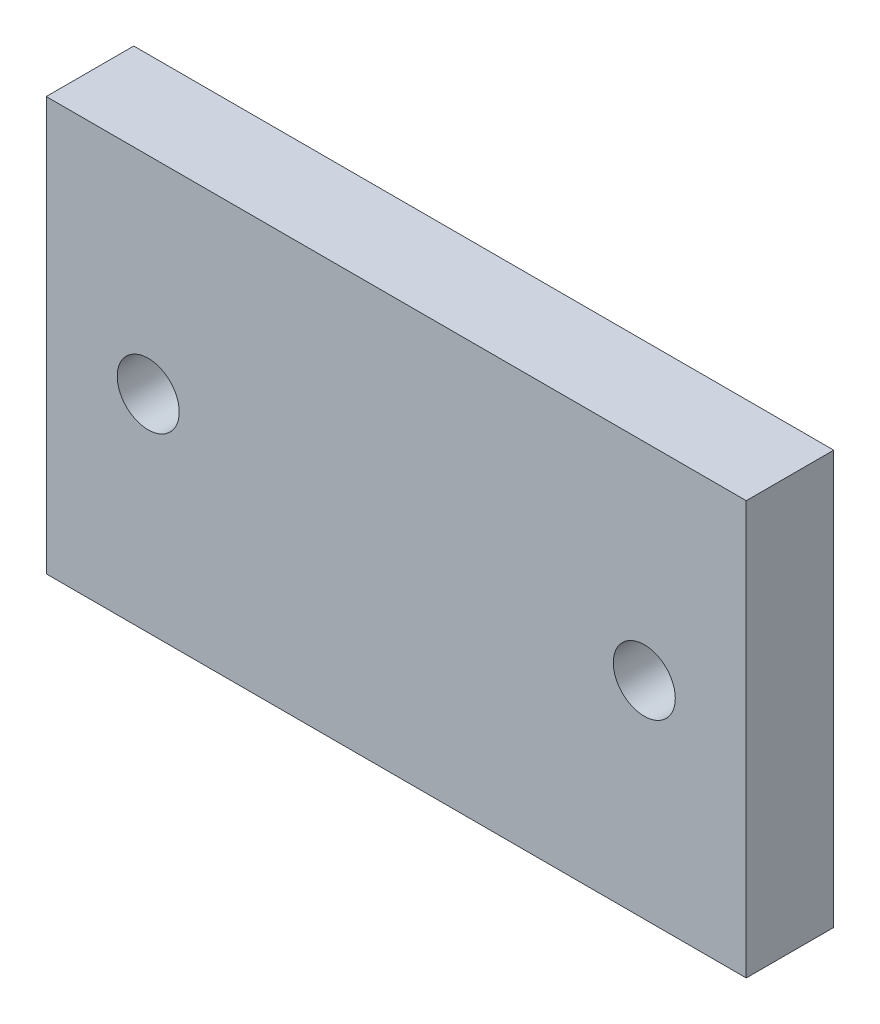
ISO-10303-21;
HEADER;
FILE_DESCRIPTION(('STEP AP214'),'2;1');
FILE_NAME('part.step','',(''),(''),'','','');
FILE_SCHEMA(('AUTOMOTIVE_DESIGN { 1 0 10303 214 1 1 1 1 }'));
ENDSEC;
DATA;
#1=APPLICATION_CONTEXT('core data for automotive mechanical design processes');
#2=APPLICATION_PROTOCOL_DEFINITION('international standard','automotive_design',2000,#1);
#3=PRODUCT_CONTEXT('',#1,'mechanical');
#4=PRODUCT('Part','Part','',(#3));
#5=PRODUCT_RELATED_PRODUCT_CATEGORY('part','',(#4));
#6=PRODUCT_DEFINITION_FORMATION('','',#4);
#7=PRODUCT_DEFINITION_CONTEXT('part definition',#1,'design');
#8=PRODUCT_DEFINITION('design','',#6,#7);
#9=PRODUCT_DEFINITION_SHAPE('','',#8);
#10=(LENGTH_UNIT() NAMED_UNIT(*) SI_UNIT(.MILLI.,.METRE.));
#11=(NAMED_UNIT(*) PLANE_ANGLE_UNIT() SI_UNIT($,.RADIAN.));
#12=(NAMED_UNIT(*) SI_UNIT($,.STERADIAN.) SOLID_ANGLE_UNIT());
#13=UNCERTAINTY_MEASURE_WITH_UNIT(LENGTH_MEASURE(1.E-05),#10,'distance_accuracy_value','');
#14=(GEOMETRIC_REPRESENTATION_CONTEXT(3) GLOBAL_UNCERTAINTY_ASSIGNED_CONTEXT((#13)) GLOBAL_UNIT_ASSIGNED_CONTEXT((#10,
#11,#12)) REPRESENTATION_CONTEXT('',''));
#15=CARTESIAN_POINT('',(0.,0.,0.));
#16=DIRECTION('',(0.,0.,1.));
#17=DIRECTION('',(1.,0.,0.));
#18=AXIS2_PLACEMENT_3D('',#15,#16,#17);
#19=CARTESIAN_POINT('',(0.,0.,6.35));
#20=DIRECTION('',(0.,0.,-1.));
#21=DIRECTION('',(-1.,0.,0.));
#22=AXIS2_PLACEMENT_3D('',#19,#20,#21);
#23=PLANE('',#22);
#24=CARTESIAN_POINT('',(7.400000059,15.,6.35));
#25=DIRECTION('',(0.,0.,1.));
#26=DIRECTION('',(1.,0.,0.));
#27=AXIS2_PLACEMENT_3D('',#24,#25,#26);
#28=CIRCLE('',#27,2.25);
#29=CARTESIAN_POINT('',(9.650000059,15.,6.35));
#30=VERTEX_POINT('',#29);
#31=EDGE_CURVE('E142',#30,#30,#28,.T.);
#32=ORIENTED_EDGE('',*,*,#31,.F.);
#33=EDGE_LOOP('',(#32));
#34=FACE_BOUND('',#33,.T.);
#35=DIRECTION('',(0.,-1.,0.));
#36=VECTOR('',#35,1.);
#37=CARTESIAN_POINT('',(0.,0.,6.35));
#38=LINE('',#37,#36);
#39=CARTESIAN_POINT('',(0.,30.,6.35));
#40=VERTEX_POINT('',#39);
#41=CARTESIAN_POINT('',(0.,0.,6.35));
#42=VERTEX_POINT('',#41);
#43=EDGE_CURVE('E150',#40,#42,#38,.T.);
#44=ORIENTED_EDGE('',*,*,#43,.T.);
#45=DIRECTION('',(1.,0.,0.));
#46=VECTOR('',#45,1.);
#47=CARTESIAN_POINT('',(0.,0.,6.35));
#48=LINE('',#47,#46);
#49=CARTESIAN_POINT('',(50.8,0.,6.35));
#50=VERTEX_POINT('',#49);
#51=EDGE_CURVE('E101',#42,#50,#48,.T.);
#52=ORIENTED_EDGE('',*,*,#51,.T.);
#53=DIRECTION('',(0.,1.,0.));
#54=VECTOR('',#53,1.);
#55=CARTESIAN_POINT('',(50.8,0.,6.35));
#56=LINE('',#55,#54);
#57=CARTESIAN_POINT('',(50.8,30.,6.35));
#58=VERTEX_POINT('',#57);
#59=EDGE_CURVE('E155',#50,#58,#56,.T.);
#60=ORIENTED_EDGE('',*,*,#59,.T.);
#61=DIRECTION('',(-1.,0.,0.));
#62=VECTOR('',#61,1.);
#63=CARTESIAN_POINT('',(0.,30.,6.35));
#64=LINE('',#63,#62);
#65=EDGE_CURVE('E70',#58,#40,#64,.T.);
#66=ORIENTED_EDGE('',*,*,#65,.T.);
#67=EDGE_LOOP('',(#44,#52,#60,#66));
#68=FACE_BOUND('',#67,.T.);
#69=CARTESIAN_POINT('',(43.400000059,15.,6.35));
#70=DIRECTION('',(0.,0.,1.));
#71=DIRECTION('',(1.,0.,0.));
#72=AXIS2_PLACEMENT_3D('',#69,#70,#71);
#73=CIRCLE('',#72,2.25);
#74=CARTESIAN_POINT('',(45.650000059,15.,6.35));
#75=VERTEX_POINT('',#74);
#76=EDGE_CURVE('E135',#75,#75,#73,.T.);
#77=ORIENTED_EDGE('',*,*,#76,.F.);
#78=EDGE_LOOP('',(#77));
#79=FACE_BOUND('',#78,.T.);
#80=ADVANCED_FACE('F52',(#34,#68,#79),#23,.F.);
#81=CARTESIAN_POINT('',(0.,0.,0.));
#82=DIRECTION('',(0.,0.,-1.));
#83=DIRECTION('',(-1.,0.,0.));
#84=AXIS2_PLACEMENT_3D('',#81,#82,#83);
#85=PLANE('',#84);
#86=CARTESIAN_POINT('',(7.400000059,15.,0.));
#87=DIRECTION('',(0.,0.,1.));
#88=DIRECTION('',(1.,0.,0.));
#89=AXIS2_PLACEMENT_3D('',#86,#87,#88);
#90=CIRCLE('',#89,2.25);
#91=CARTESIAN_POINT('',(9.650000059,15.,0.));
#92=VERTEX_POINT('',#91);
#93=EDGE_CURVE('E139',#92,#92,#90,.T.);
#94=ORIENTED_EDGE('',*,*,#93,.T.);
#95=EDGE_LOOP('',(#94));
#96=FACE_BOUND('',#95,.T.);
#97=DIRECTION('',(0.,-1.,0.));
#98=VECTOR('',#97,1.);
#99=CARTESIAN_POINT('',(0.,0.,0.));
#100=LINE('',#99,#98);
#101=CARTESIAN_POINT('',(0.,30.,0.));
#102=VERTEX_POINT('',#101);
#103=CARTESIAN_POINT('',(0.,0.,0.));
#104=VERTEX_POINT('',#103);
#105=EDGE_CURVE('E146',#102,#104,#100,.T.);
#106=ORIENTED_EDGE('',*,*,#105,.F.);
#107=DIRECTION('',(-1.,0.,0.));
#108=VECTOR('',#107,1.);
#109=CARTESIAN_POINT('',(0.,30.,0.));
#110=LINE('',#109,#108);
#111=CARTESIAN_POINT('',(50.8,30.,0.));
#112=VERTEX_POINT('',#111);
#113=EDGE_CURVE('E94',#112,#102,#110,.T.);
#114=ORIENTED_EDGE('',*,*,#113,.F.);
#115=DIRECTION('',(0.,1.,0.));
#116=VECTOR('',#115,1.);
#117=CARTESIAN_POINT('',(50.8,0.,0.));
#118=LINE('',#117,#116);
#119=CARTESIAN_POINT('',(50.8,0.,0.));
#120=VERTEX_POINT('',#119);
#121=EDGE_CURVE('E88',#120,#112,#118,.T.);
#122=ORIENTED_EDGE('',*,*,#121,.F.);
#123=DIRECTION('',(1.,0.,0.));
#124=VECTOR('',#123,1.);
#125=CARTESIAN_POINT('',(0.,0.,0.));
#126=LINE('',#125,#124);
#127=EDGE_CURVE('E164',#104,#120,#126,.T.);
#128=ORIENTED_EDGE('',*,*,#127,.F.);
#129=EDGE_LOOP('',(#106,#114,#122,#128));
#130=FACE_BOUND('',#129,.T.);
#131=CARTESIAN_POINT('',(43.400000059,15.,0.));
#132=DIRECTION('',(0.,0.,1.));
#133=DIRECTION('',(1.,0.,0.));
#134=AXIS2_PLACEMENT_3D('',#131,#132,#133);
#135=CIRCLE('',#134,2.25);
#136=CARTESIAN_POINT('',(45.650000059,15.,0.));
#137=VERTEX_POINT('',#136);
#138=EDGE_CURVE('E134',#137,#137,#135,.T.);
#139=ORIENTED_EDGE('',*,*,#138,.T.);
#140=EDGE_LOOP('',(#139));
#141=FACE_BOUND('',#140,.T.);
#142=ADVANCED_FACE('F180',(#96,#130,#141),#85,.T.);
#143=CARTESIAN_POINT('',(0.,0.,6.35));
#144=DIRECTION('',(1.,0.,0.));
#145=DIRECTION('',(0.,0.,-1.));
#146=AXIS2_PLACEMENT_3D('',#143,#144,#145);
#147=PLANE('',#146);
#148=ORIENTED_EDGE('',*,*,#105,.T.);
#149=DIRECTION('',(0.,0.,-1.));
#150=VECTOR('',#149,1.);
#151=CARTESIAN_POINT('',(0.,0.,6.35));
#152=LINE('',#151,#150);
#153=EDGE_CURVE('E13',#42,#104,#152,.T.);
#154=ORIENTED_EDGE('',*,*,#153,.F.);
#155=ORIENTED_EDGE('',*,*,#43,.F.);
#156=DIRECTION('',(0.,0.,-1.));
#157=VECTOR('',#156,1.);
#158=CARTESIAN_POINT('',(0.,30.,6.35));
#159=LINE('',#158,#157);
#160=EDGE_CURVE('E160',#40,#102,#159,.T.);
#161=ORIENTED_EDGE('',*,*,#160,.T.);
#162=EDGE_LOOP('',(#148,#154,#155,#161));
#163=FACE_BOUND('',#162,.T.);
#164=ADVANCED_FACE('F54',(#163),#147,.F.);
#165=CARTESIAN_POINT('',(0.,0.,6.35));
#166=DIRECTION('',(0.,1.,0.));
#167=DIRECTION('',(0.,0.,1.));
#168=AXIS2_PLACEMENT_3D('',#165,#166,#167);
#169=PLANE('',#168);
#170=CARTESIAN_POINT('',(12.7,0.,3.175));
#171=DIRECTION('',(0.,-1.,0.));
#172=DIRECTION('',(0.,0.,-1.));
#173=AXIS2_PLACEMENT_3D('',#170,#171,#172);
#174=CIRCLE('',#173,1.64999999999999);
#175=CARTESIAN_POINT('',(12.7,0.,1.52500000000001));
#176=VERTEX_POINT('',#175);
#177=EDGE_CURVE('E120',#176,#176,#174,.T.);
#178=ORIENTED_EDGE('',*,*,#177,.F.);
#179=EDGE_LOOP('',(#178));
#180=FACE_BOUND('',#179,.T.);
#181=CARTESIAN_POINT('',(38.1,0.,3.17500000000001));
#182=DIRECTION('',(0.,-1.,0.));
#183=DIRECTION('',(0.,0.,-1.));
#184=AXIS2_PLACEMENT_3D('',#181,#182,#183);
#185=CIRCLE('',#184,1.64999999999999);
#186=CARTESIAN_POINT('',(38.1,0.,1.52500000000001));
#187=VERTEX_POINT('',#186);
#188=EDGE_CURVE('E119',#187,#187,#185,.T.);
#189=ORIENTED_EDGE('',*,*,#188,.F.);
#190=EDGE_LOOP('',(#189));
#191=FACE_BOUND('',#190,.T.);
#192=ORIENTED_EDGE('',*,*,#127,.T.);
#193=DIRECTION('',(0.,0.,-1.));
#194=VECTOR('',#193,1.);
#195=CARTESIAN_POINT('',(50.8,0.,6.35));
#196=LINE('',#195,#194);
#197=EDGE_CURVE('E62',#50,#120,#196,.T.);
#198=ORIENTED_EDGE('',*,*,#197,.F.);
#199=ORIENTED_EDGE('',*,*,#51,.F.);
#200=ORIENTED_EDGE('',*,*,#153,.T.);
#201=EDGE_LOOP('',(#192,#198,#199,#200));
#202=FACE_BOUND('',#201,.T.);
#203=ADVANCED_FACE('F196',(#180,#191,#202),#169,.F.);
#204=CARTESIAN_POINT('',(50.8,0.,6.35));
#205=DIRECTION('',(-1.,0.,0.));
#206=DIRECTION('',(0.,0.,1.));
#207=AXIS2_PLACEMENT_3D('',#204,#205,#206);
#208=PLANE('',#207);
#209=ORIENTED_EDGE('',*,*,#121,.T.);
#210=DIRECTION('',(0.,0.,-1.));
#211=VECTOR('',#210,1.);
#212=CARTESIAN_POINT('',(50.8,30.,6.35));
#213=LINE('',#212,#211);
#214=EDGE_CURVE('E173',#58,#112,#213,.T.);
#215=ORIENTED_EDGE('',*,*,#214,.F.);
#216=ORIENTED_EDGE('',*,*,#59,.F.);
#217=ORIENTED_EDGE('',*,*,#197,.T.);
#218=EDGE_LOOP('',(#209,#215,#216,#217));
#219=FACE_BOUND('',#218,.T.);
#220=ADVANCED_FACE('F177',(#219),#208,.F.);
#221=CARTESIAN_POINT('',(0.,30.,6.35));
#222=DIRECTION('',(0.,-1.,0.));
#223=DIRECTION('',(0.,0.,-1.));
#224=AXIS2_PLACEMENT_3D('',#221,#222,#223);
#225=PLANE('',#224);
#226=ORIENTED_EDGE('',*,*,#113,.T.);
#227=ORIENTED_EDGE('',*,*,#160,.F.);
#228=ORIENTED_EDGE('',*,*,#65,.F.);
#229=ORIENTED_EDGE('',*,*,#214,.T.);
#230=EDGE_LOOP('',(#226,#227,#228,#229));
#231=FACE_BOUND('',#230,.T.);
#232=ADVANCED_FACE('F185',(#231),#225,.F.);
#233=CARTESIAN_POINT('',(7.400000059,15.,6.35));
#234=DIRECTION('',(0.,0.,-1.));
#235=DIRECTION('',(-1.,0.,0.));
#236=AXIS2_PLACEMENT_3D('',#233,#234,#235);
#237=CYLINDRICAL_SURFACE('',#236,2.25);
#238=ORIENTED_EDGE('',*,*,#31,.T.);
#239=EDGE_LOOP('',(#238));
#240=FACE_BOUND('',#239,.T.);
#241=ORIENTED_EDGE('',*,*,#93,.F.);
#242=EDGE_LOOP('',(#241));
#243=FACE_BOUND('',#242,.T.);
#244=ADVANCED_FACE('F187',(#240,#243),#237,.F.);
#245=CARTESIAN_POINT('',(43.400000059,15.,6.35));
#246=DIRECTION('',(0.,0.,-1.));
#247=DIRECTION('',(-1.,0.,0.));
#248=AXIS2_PLACEMENT_3D('',#245,#246,#247);
#249=CYLINDRICAL_SURFACE('',#248,2.25);
#250=ORIENTED_EDGE('',*,*,#76,.T.);
#251=EDGE_LOOP('',(#250));
#252=FACE_BOUND('',#251,.T.);
#253=ORIENTED_EDGE('',*,*,#138,.F.);
#254=EDGE_LOOP('',(#253));
#255=FACE_BOUND('',#254,.T.);
#256=ADVANCED_FACE('F193',(#252,#255),#249,.F.);
#257=CARTESIAN_POINT('',(38.1,14.732,3.17500000000001));
#258=DIRECTION('',(0.,-1.,0.));
#259=DIRECTION('',(0.,0.,-1.));
#260=AXIS2_PLACEMENT_3D('',#257,#258,#259);
#261=CONICAL_SURFACE('',#260,1.64999999999998,1.02974425867665);
#262=CARTESIAN_POINT('',(38.1,15.7234200213955,3.17500000000001));
#263=VERTEX_POINT('',#262);
#264=VERTEX_LOOP('',#263);
#265=FACE_BOUND('',#264,.T.);
#266=CARTESIAN_POINT('',(38.1,14.732,3.17500000000001));
#267=DIRECTION('',(0.,-1.,0.));
#268=DIRECTION('',(0.,0.,-1.));
#269=AXIS2_PLACEMENT_3D('',#266,#267,#268);
#270=CIRCLE('',#269,1.64999999999998);
#271=CARTESIAN_POINT('',(38.1,14.732,1.52500000000002));
#272=VERTEX_POINT('',#271);
#273=EDGE_CURVE('E126',#272,#272,#270,.T.);
#274=ORIENTED_EDGE('',*,*,#273,.T.);
#275=EDGE_LOOP('',(#274));
#276=FACE_BOUND('',#275,.T.);
#277=ADVANCED_FACE('F210',(#265,#276),#261,.F.);
#278=CARTESIAN_POINT('',(38.1,0.,3.17500000000001));
#279=DIRECTION('',(0.,-1.,0.));
#280=DIRECTION('',(0.,0.,-1.));
#281=AXIS2_PLACEMENT_3D('',#278,#279,#280);
#282=CYLINDRICAL_SURFACE('',#281,1.64999999999999);
#283=ORIENTED_EDGE('',*,*,#273,.F.);
#284=EDGE_LOOP('',(#283));
#285=FACE_BOUND('',#284,.T.);
#286=ORIENTED_EDGE('',*,*,#188,.T.);
#287=EDGE_LOOP('',(#286));
#288=FACE_BOUND('',#287,.T.);
#289=ADVANCED_FACE('F112',(#285,#288),#282,.F.);
#290=CARTESIAN_POINT('',(12.7,14.732,3.175));
#291=DIRECTION('',(0.,-1.,0.));
#292=DIRECTION('',(0.,0.,-1.));
#293=AXIS2_PLACEMENT_3D('',#290,#291,#292);
#294=CONICAL_SURFACE('',#293,1.64999999999999,1.02974425867665);
#295=CARTESIAN_POINT('',(12.7,15.7234200213955,3.175));
#296=VERTEX_POINT('',#295);
#297=VERTEX_LOOP('',#296);
#298=FACE_BOUND('',#297,.T.);
#299=CARTESIAN_POINT('',(12.7,14.732,3.175));
#300=DIRECTION('',(0.,-1.,0.));
#301=DIRECTION('',(0.,0.,-1.));
#302=AXIS2_PLACEMENT_3D('',#299,#300,#301);
#303=CIRCLE('',#302,1.64999999999999);
#304=CARTESIAN_POINT('',(12.7,14.732,1.52500000000002));
#305=VERTEX_POINT('',#304);
#306=EDGE_CURVE('E116',#305,#305,#303,.T.);
#307=ORIENTED_EDGE('',*,*,#306,.T.);
#308=EDGE_LOOP('',(#307));
#309=FACE_BOUND('',#308,.T.);
#310=ADVANCED_FACE('F108',(#298,#309),#294,.F.);
#311=CARTESIAN_POINT('',(12.7,0.,3.175));
#312=DIRECTION('',(0.,-1.,0.));
#313=DIRECTION('',(0.,0.,-1.));
#314=AXIS2_PLACEMENT_3D('',#311,#312,#313);
#315=CYLINDRICAL_SURFACE('',#314,1.64999999999999);
#316=ORIENTED_EDGE('',*,*,#306,.F.);
#317=EDGE_LOOP('',(#316));
#318=FACE_BOUND('',#317,.T.);
#319=ORIENTED_EDGE('',*,*,#177,.T.);
#320=EDGE_LOOP('',(#319));
#321=FACE_BOUND('',#320,.T.);
#322=ADVANCED_FACE('F111',(#318,#321),#315,.F.);
#323=CLOSED_SHELL('',(#80,#142,#164,#203,#220,#232,#244,#256,#277,#289,#310,#322));
#324=MANIFOLD_SOLID_BREP('B2',#323);
#325=ADVANCED_BREP_SHAPE_REPRESENTATION('',(#18,#324),#14);
#326=SHAPE_DEFINITION_REPRESENTATION(#9,#325);
ENDSEC;
END-ISO-10303-21;
